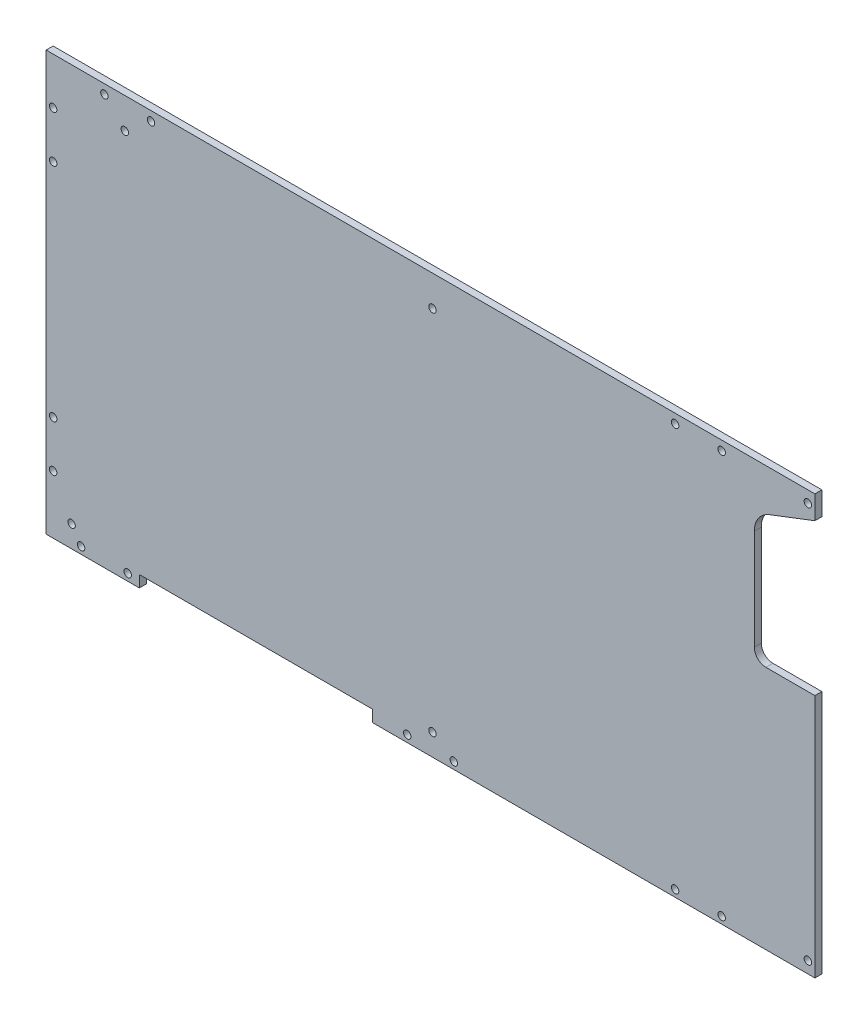
ISO-10303-21;
HEADER;
FILE_DESCRIPTION(('STEP AP214'),'2;1');
FILE_NAME('part.step','',(''),(''),'','','');
FILE_SCHEMA(('AUTOMOTIVE_DESIGN { 1 0 10303 214 1 1 1 1 }'));
ENDSEC;
DATA;
#1=APPLICATION_CONTEXT('core data for automotive mechanical design processes');
#2=APPLICATION_PROTOCOL_DEFINITION('international standard','automotive_design',2000,#1);
#3=PRODUCT_CONTEXT('',#1,'mechanical');
#4=PRODUCT('Part','Part','',(#3));
#5=PRODUCT_RELATED_PRODUCT_CATEGORY('part','',(#4));
#6=PRODUCT_DEFINITION_FORMATION('','',#4);
#7=PRODUCT_DEFINITION_CONTEXT('part definition',#1,'design');
#8=PRODUCT_DEFINITION('design','',#6,#7);
#9=PRODUCT_DEFINITION_SHAPE('','',#8);
#10=(LENGTH_UNIT() NAMED_UNIT(*) SI_UNIT(.MILLI.,.METRE.));
#11=(NAMED_UNIT(*) PLANE_ANGLE_UNIT() SI_UNIT($,.RADIAN.));
#12=(NAMED_UNIT(*) SI_UNIT($,.STERADIAN.) SOLID_ANGLE_UNIT());
#13=UNCERTAINTY_MEASURE_WITH_UNIT(LENGTH_MEASURE(1.E-05),#10,'distance_accuracy_value','');
#14=(GEOMETRIC_REPRESENTATION_CONTEXT(3) GLOBAL_UNCERTAINTY_ASSIGNED_CONTEXT((#13)) GLOBAL_UNIT_ASSIGNED_CONTEXT((#10,
#11,#12)) REPRESENTATION_CONTEXT('',''));
#15=CARTESIAN_POINT('',(0.,0.,0.));
#16=DIRECTION('',(0.,0.,1.));
#17=DIRECTION('',(1.,0.,0.));
#18=AXIS2_PLACEMENT_3D('',#15,#16,#17);
#19=CARTESIAN_POINT('',(330.,0.,3.));
#20=DIRECTION('',(-1.,0.,0.));
#21=DIRECTION('',(0.,0.,1.));
#22=AXIS2_PLACEMENT_3D('',#19,#20,#21);
#23=PLANE('',#22);
#24=DIRECTION('',(0.,1.,0.));
#25=VECTOR('',#24,1.);
#26=CARTESIAN_POINT('',(330.,0.,3.));
#27=LINE('',#26,#25);
#28=CARTESIAN_POINT('',(330.,170.,3.));
#29=VERTEX_POINT('',#28);
#30=CARTESIAN_POINT('',(330.,180.,3.));
#31=VERTEX_POINT('',#30);
#32=EDGE_CURVE('E201',#29,#31,#27,.T.);
#33=ORIENTED_EDGE('',*,*,#32,.F.);
#34=DIRECTION('',(0.,0.,1.));
#35=VECTOR('',#34,1.);
#36=CARTESIAN_POINT('',(330.,170.,-0.00100000000000013));
#37=LINE('',#36,#35);
#38=CARTESIAN_POINT('',(330.,170.,0.));
#39=VERTEX_POINT('',#38);
#40=EDGE_CURVE('E143',#39,#29,#37,.T.);
#41=ORIENTED_EDGE('',*,*,#40,.F.);
#42=DIRECTION('',(0.,1.,0.));
#43=VECTOR('',#42,1.);
#44=CARTESIAN_POINT('',(330.,0.,0.));
#45=LINE('',#44,#43);
#46=CARTESIAN_POINT('',(330.,180.,0.));
#47=VERTEX_POINT('',#46);
#48=EDGE_CURVE('E162',#39,#47,#45,.T.);
#49=ORIENTED_EDGE('',*,*,#48,.T.);
#50=DIRECTION('',(0.,0.,-1.));
#51=VECTOR('',#50,1.);
#52=CARTESIAN_POINT('',(330.,180.,3.));
#53=LINE('',#52,#51);
#54=EDGE_CURVE('E173',#31,#47,#53,.T.);
#55=ORIENTED_EDGE('',*,*,#54,.F.);
#56=EDGE_LOOP('',(#33,#41,#49,#55));
#57=FACE_BOUND('',#56,.T.);
#58=ADVANCED_FACE('F32',(#57),#23,.F.);
#59=CARTESIAN_POINT('',(0.,0.,3.));
#60=DIRECTION('',(0.,1.,0.));
#61=DIRECTION('',(0.,0.,1.));
#62=AXIS2_PLACEMENT_3D('',#59,#60,#61);
#63=PLANE('',#62);
#64=DIRECTION('',(1.,0.,0.));
#65=VECTOR('',#64,1.);
#66=CARTESIAN_POINT('',(0.,0.,0.));
#67=LINE('',#66,#65);
#68=CARTESIAN_POINT('',(0.,0.,0.));
#69=VERTEX_POINT('',#68);
#70=CARTESIAN_POINT('',(40.,0.,0.));
#71=VERTEX_POINT('',#70);
#72=EDGE_CURVE('E166',#69,#71,#67,.T.);
#73=ORIENTED_EDGE('',*,*,#72,.T.);
#74=DIRECTION('',(0.,0.,1.));
#75=VECTOR('',#74,1.);
#76=CARTESIAN_POINT('',(40.,0.,-0.00100000000000013));
#77=LINE('',#76,#75);
#78=CARTESIAN_POINT('',(40.,0.,3.));
#79=VERTEX_POINT('',#78);
#80=EDGE_CURVE('E325',#71,#79,#77,.T.);
#81=ORIENTED_EDGE('',*,*,#80,.T.);
#82=DIRECTION('',(1.,0.,0.));
#83=VECTOR('',#82,1.);
#84=CARTESIAN_POINT('',(0.,0.,3.));
#85=LINE('',#84,#83);
#86=CARTESIAN_POINT('',(0.,0.,3.));
#87=VERTEX_POINT('',#86);
#88=EDGE_CURVE('E202',#87,#79,#85,.T.);
#89=ORIENTED_EDGE('',*,*,#88,.F.);
#90=DIRECTION('',(0.,0.,-1.));
#91=VECTOR('',#90,1.);
#92=CARTESIAN_POINT('',(0.,0.,3.));
#93=LINE('',#92,#91);
#94=EDGE_CURVE('E11',#87,#69,#93,.T.);
#95=ORIENTED_EDGE('',*,*,#94,.T.);
#96=EDGE_LOOP('',(#73,#81,#89,#95));
#97=FACE_BOUND('',#96,.T.);
#98=ADVANCED_FACE('F396',(#97),#63,.F.);
#99=CARTESIAN_POINT('',(0.,0.,3.));
#100=DIRECTION('',(1.,0.,0.));
#101=DIRECTION('',(0.,0.,-1.));
#102=AXIS2_PLACEMENT_3D('',#99,#100,#101);
#103=PLANE('',#102);
#104=DIRECTION('',(0.,-1.,0.));
#105=VECTOR('',#104,1.);
#106=CARTESIAN_POINT('',(0.,0.,0.));
#107=LINE('',#106,#105);
#108=CARTESIAN_POINT('',(0.,180.,0.));
#109=VERTEX_POINT('',#108);
#110=EDGE_CURVE('E187',#109,#69,#107,.T.);
#111=ORIENTED_EDGE('',*,*,#110,.T.);
#112=ORIENTED_EDGE('',*,*,#94,.F.);
#113=DIRECTION('',(0.,-1.,0.));
#114=VECTOR('',#113,1.);
#115=CARTESIAN_POINT('',(0.,0.,3.));
#116=LINE('',#115,#114);
#117=CARTESIAN_POINT('',(0.,180.,3.));
#118=VERTEX_POINT('',#117);
#119=EDGE_CURVE('E164',#118,#87,#116,.T.);
#120=ORIENTED_EDGE('',*,*,#119,.F.);
#121=DIRECTION('',(0.,0.,-1.));
#122=VECTOR('',#121,1.);
#123=CARTESIAN_POINT('',(0.,180.,3.));
#124=LINE('',#123,#122);
#125=EDGE_CURVE('E170',#118,#109,#124,.T.);
#126=ORIENTED_EDGE('',*,*,#125,.T.);
#127=EDGE_LOOP('',(#111,#112,#120,#126));
#128=FACE_BOUND('',#127,.T.);
#129=ADVANCED_FACE('F34',(#128),#103,.F.);
#130=CARTESIAN_POINT('',(140.,0.,3.));
#131=VERTEX_POINT('',#130);
#132=CARTESIAN_POINT('',(330.,0.,3.));
#133=VERTEX_POINT('',#132);
#134=EDGE_CURVE('E205',#131,#133,#85,.T.);
#135=ORIENTED_EDGE('',*,*,#134,.F.);
#136=DIRECTION('',(0.,0.,1.));
#137=VECTOR('',#136,1.);
#138=CARTESIAN_POINT('',(140.,0.,-0.00100000000000013));
#139=LINE('',#138,#137);
#140=CARTESIAN_POINT('',(140.,0.,0.));
#141=VERTEX_POINT('',#140);
#142=EDGE_CURVE('E328',#141,#131,#139,.T.);
#143=ORIENTED_EDGE('',*,*,#142,.F.);
#144=CARTESIAN_POINT('',(330.,0.,0.));
#145=VERTEX_POINT('',#144);
#146=EDGE_CURVE('E192',#141,#145,#67,.T.);
#147=ORIENTED_EDGE('',*,*,#146,.T.);
#148=DIRECTION('',(0.,0.,-1.));
#149=VECTOR('',#148,1.);
#150=CARTESIAN_POINT('',(330.,0.,3.));
#151=LINE('',#150,#149);
#152=EDGE_CURVE('E40',#133,#145,#151,.T.);
#153=ORIENTED_EDGE('',*,*,#152,.F.);
#154=EDGE_LOOP('',(#135,#143,#147,#153));
#155=FACE_BOUND('',#154,.T.);
#156=ADVANCED_FACE('F387',(#155),#63,.F.);
#157=CARTESIAN_POINT('',(330.,105.,0.));
#158=VERTEX_POINT('',#157);
#159=EDGE_CURVE('E153',#145,#158,#45,.T.);
#160=ORIENTED_EDGE('',*,*,#159,.T.);
#161=DIRECTION('',(0.,0.,1.));
#162=VECTOR('',#161,1.);
#163=CARTESIAN_POINT('',(330.,105.,-0.00100000000000013));
#164=LINE('',#163,#162);
#165=CARTESIAN_POINT('',(330.,105.,3.));
#166=VERTEX_POINT('',#165);
#167=EDGE_CURVE('E132',#158,#166,#164,.T.);
#168=ORIENTED_EDGE('',*,*,#167,.T.);
#169=EDGE_CURVE('E199',#133,#166,#27,.T.);
#170=ORIENTED_EDGE('',*,*,#169,.F.);
#171=ORIENTED_EDGE('',*,*,#152,.T.);
#172=EDGE_LOOP('',(#160,#168,#170,#171));
#173=FACE_BOUND('',#172,.T.);
#174=ADVANCED_FACE('F159',(#173),#23,.F.);
#175=CARTESIAN_POINT('',(0.,180.,3.));
#176=DIRECTION('',(0.,-1.,0.));
#177=DIRECTION('',(0.,0.,-1.));
#178=AXIS2_PLACEMENT_3D('',#175,#176,#177);
#179=PLANE('',#178);
#180=DIRECTION('',(-1.,0.,0.));
#181=VECTOR('',#180,1.);
#182=CARTESIAN_POINT('',(0.,180.,0.));
#183=LINE('',#182,#181);
#184=EDGE_CURVE('E161',#47,#109,#183,.T.);
#185=ORIENTED_EDGE('',*,*,#184,.T.);
#186=ORIENTED_EDGE('',*,*,#125,.F.);
#187=DIRECTION('',(-1.,0.,0.));
#188=VECTOR('',#187,1.);
#189=CARTESIAN_POINT('',(0.,180.,3.));
#190=LINE('',#189,#188);
#191=EDGE_CURVE('E174',#31,#118,#190,.T.);
#192=ORIENTED_EDGE('',*,*,#191,.F.);
#193=ORIENTED_EDGE('',*,*,#54,.T.);
#194=EDGE_LOOP('',(#185,#186,#192,#193));
#195=FACE_BOUND('',#194,.T.);
#196=ADVANCED_FACE('F180',(#195),#179,.F.);
#197=CARTESIAN_POINT('',(0.,0.,3.));
#198=DIRECTION('',(0.,0.,-1.));
#199=DIRECTION('',(-1.,0.,0.));
#200=AXIS2_PLACEMENT_3D('',#197,#198,#199);
#201=PLANE('',#200);
#202=CARTESIAN_POINT('',(3.,140.,3.));
#203=DIRECTION('',(0.,0.,1.));
#204=DIRECTION('',(1.,0.,0.));
#205=AXIS2_PLACEMENT_3D('',#202,#203,#204);
#206=CIRCLE('',#205,1.6);
#207=CARTESIAN_POINT('',(4.6,140.,3.));
#208=VERTEX_POINT('',#207);
#209=EDGE_CURVE('E278',#208,#208,#206,.T.);
#210=ORIENTED_EDGE('',*,*,#209,.F.);
#211=EDGE_LOOP('',(#210));
#212=FACE_BOUND('',#211,.T.);
#213=CARTESIAN_POINT('',(3.,45.,3.));
#214=DIRECTION('',(0.,0.,1.));
#215=DIRECTION('',(1.,0.,0.));
#216=AXIS2_PLACEMENT_3D('',#213,#214,#215);
#217=CIRCLE('',#216,1.6);
#218=CARTESIAN_POINT('',(4.6,45.,3.));
#219=VERTEX_POINT('',#218);
#220=EDGE_CURVE('E272',#219,#219,#217,.T.);
#221=ORIENTED_EDGE('',*,*,#220,.F.);
#222=EDGE_LOOP('',(#221));
#223=FACE_BOUND('',#222,.T.);
#224=CARTESIAN_POINT('',(3.,25.,3.));
#225=DIRECTION('',(0.,0.,1.));
#226=DIRECTION('',(1.,0.,0.));
#227=AXIS2_PLACEMENT_3D('',#224,#225,#226);
#228=CIRCLE('',#227,1.6);
#229=CARTESIAN_POINT('',(4.6,25.,3.));
#230=VERTEX_POINT('',#229);
#231=EDGE_CURVE('E266',#230,#230,#228,.T.);
#232=ORIENTED_EDGE('',*,*,#231,.F.);
#233=EDGE_LOOP('',(#232));
#234=FACE_BOUND('',#233,.T.);
#235=CARTESIAN_POINT('',(15.,3.,3.));
#236=DIRECTION('',(0.,0.,1.));
#237=DIRECTION('',(1.,0.,0.));
#238=AXIS2_PLACEMENT_3D('',#235,#236,#237);
#239=CIRCLE('',#238,1.6);
#240=CARTESIAN_POINT('',(16.6,3.,3.));
#241=VERTEX_POINT('',#240);
#242=EDGE_CURVE('E248',#241,#241,#239,.T.);
#243=ORIENTED_EDGE('',*,*,#242,.F.);
#244=EDGE_LOOP('',(#243));
#245=FACE_BOUND('',#244,.T.);
#246=CARTESIAN_POINT('',(25.,176.,3.));
#247=DIRECTION('',(0.,0.,1.));
#248=DIRECTION('',(1.,0.,0.));
#249=AXIS2_PLACEMENT_3D('',#246,#247,#248);
#250=CIRCLE('',#249,1.59999999999999);
#251=CARTESIAN_POINT('',(26.6,176.,3.));
#252=VERTEX_POINT('',#251);
#253=EDGE_CURVE('E249',#252,#252,#250,.T.);
#254=ORIENTED_EDGE('',*,*,#253,.F.);
#255=EDGE_LOOP('',(#254));
#256=FACE_BOUND('',#255,.T.);
#257=CARTESIAN_POINT('',(175.,3.,3.));
#258=DIRECTION('',(0.,0.,1.));
#259=DIRECTION('',(1.,0.,0.));
#260=AXIS2_PLACEMENT_3D('',#257,#258,#259);
#261=CIRCLE('',#260,1.59999999999996);
#262=CARTESIAN_POINT('',(176.6,3.,3.));
#263=VERTEX_POINT('',#262);
#264=EDGE_CURVE('E256',#263,#263,#261,.T.);
#265=ORIENTED_EDGE('',*,*,#264,.F.);
#266=EDGE_LOOP('',(#265));
#267=FACE_BOUND('',#266,.T.);
#268=CARTESIAN_POINT('',(155.,3.,3.));
#269=DIRECTION('',(0.,0.,1.));
#270=DIRECTION('',(1.,0.,0.));
#271=AXIS2_PLACEMENT_3D('',#268,#269,#270);
#272=CIRCLE('',#271,1.59999999999996);
#273=CARTESIAN_POINT('',(156.6,3.,3.));
#274=VERTEX_POINT('',#273);
#275=EDGE_CURVE('E235',#274,#274,#272,.T.);
#276=ORIENTED_EDGE('',*,*,#275,.F.);
#277=EDGE_LOOP('',(#276));
#278=FACE_BOUND('',#277,.T.);
#279=CARTESIAN_POINT('',(35.,3.,3.));
#280=DIRECTION('',(0.,0.,1.));
#281=DIRECTION('',(1.,0.,0.));
#282=AXIS2_PLACEMENT_3D('',#279,#280,#281);
#283=CIRCLE('',#282,1.60000000000001);
#284=CARTESIAN_POINT('',(36.6,3.,3.));
#285=VERTEX_POINT('',#284);
#286=EDGE_CURVE('E242',#285,#285,#283,.T.);
#287=ORIENTED_EDGE('',*,*,#286,.F.);
#288=EDGE_LOOP('',(#287));
#289=FACE_BOUND('',#288,.T.);
#290=CARTESIAN_POINT('',(327.,175.,3.));
#291=DIRECTION('',(0.,0.,1.));
#292=DIRECTION('',(1.,0.,0.));
#293=AXIS2_PLACEMENT_3D('',#290,#291,#292);
#294=CIRCLE('',#293,1.59999999999996);
#295=CARTESIAN_POINT('',(328.6,175.,3.));
#296=VERTEX_POINT('',#295);
#297=EDGE_CURVE('E307',#296,#296,#294,.T.);
#298=ORIENTED_EDGE('',*,*,#297,.F.);
#299=EDGE_LOOP('',(#298));
#300=FACE_BOUND('',#299,.T.);
#301=CARTESIAN_POINT('',(327.,5.,3.));
#302=DIRECTION('',(0.,0.,1.));
#303=DIRECTION('',(1.,0.,0.));
#304=AXIS2_PLACEMENT_3D('',#301,#302,#303);
#305=CIRCLE('',#304,1.59999999999996);
#306=CARTESIAN_POINT('',(328.6,5.,3.));
#307=VERTEX_POINT('',#306);
#308=EDGE_CURVE('E314',#307,#307,#305,.T.);
#309=ORIENTED_EDGE('',*,*,#308,.F.);
#310=EDGE_LOOP('',(#309));
#311=FACE_BOUND('',#310,.T.);
#312=CARTESIAN_POINT('',(290.,3.,3.));
#313=DIRECTION('',(0.,0.,1.));
#314=DIRECTION('',(1.,0.,0.));
#315=AXIS2_PLACEMENT_3D('',#312,#313,#314);
#316=CIRCLE('',#315,1.59999999999996);
#317=CARTESIAN_POINT('',(291.6,3.,3.));
#318=VERTEX_POINT('',#317);
#319=EDGE_CURVE('E320',#318,#318,#316,.T.);
#320=ORIENTED_EDGE('',*,*,#319,.F.);
#321=EDGE_LOOP('',(#320));
#322=FACE_BOUND('',#321,.T.);
#323=CARTESIAN_POINT('',(45.,176.,3.));
#324=DIRECTION('',(0.,0.,1.));
#325=DIRECTION('',(1.,0.,0.));
#326=AXIS2_PLACEMENT_3D('',#323,#324,#325);
#327=CIRCLE('',#326,1.6);
#328=CARTESIAN_POINT('',(46.6,176.,3.));
#329=VERTEX_POINT('',#328);
#330=EDGE_CURVE('E290',#329,#329,#327,.T.);
#331=ORIENTED_EDGE('',*,*,#330,.F.);
#332=EDGE_LOOP('',(#331));
#333=FACE_BOUND('',#332,.T.);
#334=CARTESIAN_POINT('',(270.,176.,3.));
#335=DIRECTION('',(0.,0.,1.));
#336=DIRECTION('',(1.,0.,0.));
#337=AXIS2_PLACEMENT_3D('',#334,#335,#336);
#338=CIRCLE('',#337,1.59999999999996);
#339=CARTESIAN_POINT('',(271.6,176.,3.));
#340=VERTEX_POINT('',#339);
#341=EDGE_CURVE('E283',#340,#340,#338,.T.);
#342=ORIENTED_EDGE('',*,*,#341,.F.);
#343=EDGE_LOOP('',(#342));
#344=FACE_BOUND('',#343,.T.);
#345=CARTESIAN_POINT('',(290.,176.,3.));
#346=DIRECTION('',(0.,0.,1.));
#347=DIRECTION('',(1.,0.,0.));
#348=AXIS2_PLACEMENT_3D('',#345,#346,#347);
#349=CIRCLE('',#348,1.59999999999996);
#350=CARTESIAN_POINT('',(291.6,176.,3.));
#351=VERTEX_POINT('',#350);
#352=EDGE_CURVE('E302',#351,#351,#349,.T.);
#353=ORIENTED_EDGE('',*,*,#352,.F.);
#354=EDGE_LOOP('',(#353));
#355=FACE_BOUND('',#354,.T.);
#356=CARTESIAN_POINT('',(270.,3.,3.));
#357=DIRECTION('',(0.,0.,1.));
#358=DIRECTION('',(1.,0.,0.));
#359=AXIS2_PLACEMENT_3D('',#356,#357,#358);
#360=CIRCLE('',#359,1.59999999999996);
#361=CARTESIAN_POINT('',(271.6,3.,3.));
#362=VERTEX_POINT('',#361);
#363=EDGE_CURVE('E295',#362,#362,#360,.T.);
#364=ORIENTED_EDGE('',*,*,#363,.F.);
#365=EDGE_LOOP('',(#364));
#366=FACE_BOUND('',#365,.T.);
#367=CARTESIAN_POINT('',(3.,160.,3.));
#368=DIRECTION('',(0.,0.,1.));
#369=DIRECTION('',(1.,0.,0.));
#370=AXIS2_PLACEMENT_3D('',#367,#368,#369);
#371=CIRCLE('',#370,1.6);
#372=CARTESIAN_POINT('',(4.6,160.,3.));
#373=VERTEX_POINT('',#372);
#374=EDGE_CURVE('E229',#373,#373,#371,.T.);
#375=ORIENTED_EDGE('',*,*,#374,.F.);
#376=EDGE_LOOP('',(#375));
#377=FACE_BOUND('',#376,.T.);
#378=CARTESIAN_POINT('',(165.85,166.83,3.));
#379=DIRECTION('',(0.,0.,1.));
#380=DIRECTION('',(1.,0.,0.));
#381=AXIS2_PLACEMENT_3D('',#378,#379,#380);
#382=CIRCLE('',#381,1.59999999999999);
#383=CARTESIAN_POINT('',(167.45,166.83,3.));
#384=VERTEX_POINT('',#383);
#385=EDGE_CURVE('E218',#384,#384,#382,.T.);
#386=ORIENTED_EDGE('',*,*,#385,.F.);
#387=EDGE_LOOP('',(#386));
#388=FACE_BOUND('',#387,.T.);
#389=CARTESIAN_POINT('',(10.91,9.35,3.));
#390=DIRECTION('',(0.,0.,1.));
#391=DIRECTION('',(1.,0.,0.));
#392=AXIS2_PLACEMENT_3D('',#389,#390,#391);
#393=CIRCLE('',#392,1.6);
#394=CARTESIAN_POINT('',(12.51,9.35,3.));
#395=VERTEX_POINT('',#394);
#396=EDGE_CURVE('E211',#395,#395,#393,.T.);
#397=ORIENTED_EDGE('',*,*,#396,.F.);
#398=EDGE_LOOP('',(#397));
#399=FACE_BOUND('',#398,.T.);
#400=CARTESIAN_POINT('',(165.85,9.35,3.));
#401=DIRECTION('',(0.,0.,1.));
#402=DIRECTION('',(1.,0.,0.));
#403=AXIS2_PLACEMENT_3D('',#400,#401,#402);
#404=CIRCLE('',#403,1.59999999999999);
#405=CARTESIAN_POINT('',(167.45,9.35,3.));
#406=VERTEX_POINT('',#405);
#407=EDGE_CURVE('E223',#406,#406,#404,.T.);
#408=ORIENTED_EDGE('',*,*,#407,.F.);
#409=EDGE_LOOP('',(#408));
#410=FACE_BOUND('',#409,.T.);
#411=CARTESIAN_POINT('',(33.77,166.83,3.));
#412=DIRECTION('',(0.,0.,1.));
#413=DIRECTION('',(1.,0.,0.));
#414=AXIS2_PLACEMENT_3D('',#411,#412,#413);
#415=CIRCLE('',#414,1.6);
#416=CARTESIAN_POINT('',(35.37,166.83,3.));
#417=VERTEX_POINT('',#416);
#418=EDGE_CURVE('E195',#417,#417,#415,.T.);
#419=ORIENTED_EDGE('',*,*,#418,.F.);
#420=EDGE_LOOP('',(#419));
#421=FACE_BOUND('',#420,.T.);
#422=CARTESIAN_POINT('',(314.,153.132009017551,3.));
#423=DIRECTION('',(0.,0.,1.));
#424=DIRECTION('',(-1.,0.,0.));
#425=AXIS2_PLACEMENT_3D('',#422,#423,#424);
#426=CIRCLE('',#425,10.);
#427=CARTESIAN_POINT('',(310.410209206911,162.465465079581,3.));
#428=VERTEX_POINT('',#427);
#429=CARTESIAN_POINT('',(304.,153.132009017551,3.));
#430=VERTEX_POINT('',#429);
#431=EDGE_CURVE('E364',#428,#430,#426,.T.);
#432=ORIENTED_EDGE('',*,*,#431,.F.);
#433=DIRECTION('',(-0.93334560620306,-0.358979079308868,0.));
#434=VECTOR('',#433,1.);
#435=CARTESIAN_POINT('',(310.410209206911,162.465465079581,3.));
#436=LINE('',#435,#434);
#437=EDGE_CURVE('E366',#29,#428,#436,.T.);
#438=ORIENTED_EDGE('',*,*,#437,.F.);
#439=ORIENTED_EDGE('',*,*,#32,.T.);
#440=ORIENTED_EDGE('',*,*,#191,.T.);
#441=ORIENTED_EDGE('',*,*,#119,.T.);
#442=ORIENTED_EDGE('',*,*,#88,.T.);
#443=DIRECTION('',(0.,-1.,0.));
#444=VECTOR('',#443,1.);
#445=CARTESIAN_POINT('',(40.,0.,3.));
#446=LINE('',#445,#444);
#447=CARTESIAN_POINT('',(40.,5.,3.));
#448=VERTEX_POINT('',#447);
#449=EDGE_CURVE('E337',#448,#79,#446,.T.);
#450=ORIENTED_EDGE('',*,*,#449,.F.);
#451=DIRECTION('',(-1.,0.,0.));
#452=VECTOR('',#451,1.);
#453=CARTESIAN_POINT('',(40.,5.,3.));
#454=LINE('',#453,#452);
#455=CARTESIAN_POINT('',(140.,5.,3.));
#456=VERTEX_POINT('',#455);
#457=EDGE_CURVE('E329',#456,#448,#454,.T.);
#458=ORIENTED_EDGE('',*,*,#457,.F.);
#459=DIRECTION('',(0.,1.,0.));
#460=VECTOR('',#459,1.);
#461=CARTESIAN_POINT('',(140.,0.,3.));
#462=LINE('',#461,#460);
#463=EDGE_CURVE('E335',#131,#456,#462,.T.);
#464=ORIENTED_EDGE('',*,*,#463,.F.);
#465=ORIENTED_EDGE('',*,*,#134,.T.);
#466=ORIENTED_EDGE('',*,*,#169,.T.);
#467=DIRECTION('',(1.,0.,0.));
#468=VECTOR('',#467,1.);
#469=CARTESIAN_POINT('',(330.,105.,3.));
#470=LINE('',#469,#468);
#471=CARTESIAN_POINT('',(309.,105.,3.));
#472=VERTEX_POINT('',#471);
#473=EDGE_CURVE('E138',#472,#166,#470,.T.);
#474=ORIENTED_EDGE('',*,*,#473,.F.);
#475=CARTESIAN_POINT('',(309.,110.,3.));
#476=DIRECTION('',(0.,0.,1.));
#477=DIRECTION('',(-1.,0.,0.));
#478=AXIS2_PLACEMENT_3D('',#475,#476,#477);
#479=CIRCLE('',#478,5.);
#480=CARTESIAN_POINT('',(304.,110.,3.));
#481=VERTEX_POINT('',#480);
#482=EDGE_CURVE('E358',#481,#472,#479,.T.);
#483=ORIENTED_EDGE('',*,*,#482,.F.);
#484=DIRECTION('',(0.,-1.,0.));
#485=VECTOR('',#484,1.);
#486=CARTESIAN_POINT('',(304.,153.132009017551,3.));
#487=LINE('',#486,#485);
#488=EDGE_CURVE('E361',#430,#481,#487,.T.);
#489=ORIENTED_EDGE('',*,*,#488,.F.);
#490=EDGE_LOOP('',(#432,#438,#439,#440,#441,#442,#450,#458,#464,#465,#466,#474,#483,#489));
#491=FACE_BOUND('',#490,.T.);
#492=ADVANCED_FACE('F381',(#212,#223,#234,#245,#256,#267,#278,#289,#300,#311,#322,#333,#344,
#355,#366,#377,#388,#399,#410,#421,#491),#201,.F.);
#493=CARTESIAN_POINT('',(0.,0.,0.));
#494=DIRECTION('',(0.,0.,-1.));
#495=DIRECTION('',(-1.,0.,0.));
#496=AXIS2_PLACEMENT_3D('',#493,#494,#495);
#497=PLANE('',#496);
#498=DIRECTION('',(-0.93334560620306,-0.358979079308868,0.));
#499=VECTOR('',#498,1.);
#500=CARTESIAN_POINT('',(310.410209206911,162.465465079581,0.));
#501=LINE('',#500,#499);
#502=CARTESIAN_POINT('',(310.410209206911,162.465465079581,0.));
#503=VERTEX_POINT('',#502);
#504=EDGE_CURVE('E156',#39,#503,#501,.T.);
#505=ORIENTED_EDGE('',*,*,#504,.T.);
#506=CARTESIAN_POINT('',(314.,153.132009017551,0.));
#507=DIRECTION('',(0.,0.,-1.));
#508=DIRECTION('',(-1.,0.,0.));
#509=AXIS2_PLACEMENT_3D('',#506,#507,#508);
#510=CIRCLE('',#509,10.);
#511=CARTESIAN_POINT('',(304.,153.132009017551,0.));
#512=VERTEX_POINT('',#511);
#513=EDGE_CURVE('E347',#503,#512,#510,.F.);
#514=ORIENTED_EDGE('',*,*,#513,.T.);
#515=DIRECTION('',(0.,-1.,0.));
#516=VECTOR('',#515,1.);
#517=CARTESIAN_POINT('',(304.,153.132009017551,0.));
#518=LINE('',#517,#516);
#519=CARTESIAN_POINT('',(304.,110.,0.));
#520=VERTEX_POINT('',#519);
#521=EDGE_CURVE('E371',#512,#520,#518,.T.);
#522=ORIENTED_EDGE('',*,*,#521,.T.);
#523=CARTESIAN_POINT('',(309.,110.,0.));
#524=DIRECTION('',(0.,0.,-1.));
#525=DIRECTION('',(-1.,0.,0.));
#526=AXIS2_PLACEMENT_3D('',#523,#524,#525);
#527=CIRCLE('',#526,5.);
#528=CARTESIAN_POINT('',(309.,105.,0.));
#529=VERTEX_POINT('',#528);
#530=EDGE_CURVE('E155',#520,#529,#527,.F.);
#531=ORIENTED_EDGE('',*,*,#530,.T.);
#532=DIRECTION('',(1.,0.,0.));
#533=VECTOR('',#532,1.);
#534=CARTESIAN_POINT('',(330.,105.,0.));
#535=LINE('',#534,#533);
#536=EDGE_CURVE('E135',#529,#158,#535,.T.);
#537=ORIENTED_EDGE('',*,*,#536,.T.);
#538=ORIENTED_EDGE('',*,*,#159,.F.);
#539=ORIENTED_EDGE('',*,*,#146,.F.);
#540=DIRECTION('',(0.,1.,0.));
#541=VECTOR('',#540,1.);
#542=CARTESIAN_POINT('',(140.,0.,0.));
#543=LINE('',#542,#541);
#544=CARTESIAN_POINT('',(140.,5.,0.));
#545=VERTEX_POINT('',#544);
#546=EDGE_CURVE('E344',#141,#545,#543,.T.);
#547=ORIENTED_EDGE('',*,*,#546,.T.);
#548=DIRECTION('',(-1.,0.,0.));
#549=VECTOR('',#548,1.);
#550=CARTESIAN_POINT('',(40.,5.,0.));
#551=LINE('',#550,#549);
#552=CARTESIAN_POINT('',(40.,5.,0.));
#553=VERTEX_POINT('',#552);
#554=EDGE_CURVE('E341',#545,#553,#551,.T.);
#555=ORIENTED_EDGE('',*,*,#554,.T.);
#556=DIRECTION('',(0.,-1.,0.));
#557=VECTOR('',#556,1.);
#558=CARTESIAN_POINT('',(40.,0.,0.));
#559=LINE('',#558,#557);
#560=EDGE_CURVE('E339',#553,#71,#559,.T.);
#561=ORIENTED_EDGE('',*,*,#560,.T.);
#562=ORIENTED_EDGE('',*,*,#72,.F.);
#563=ORIENTED_EDGE('',*,*,#110,.F.);
#564=ORIENTED_EDGE('',*,*,#184,.F.);
#565=ORIENTED_EDGE('',*,*,#48,.F.);
#566=EDGE_LOOP('',(#505,#514,#522,#531,#537,#538,#539,#547,#555,#561,#562,#563,#564,#565));
#567=FACE_BOUND('',#566,.T.);
#568=CARTESIAN_POINT('',(3.,140.,0.));
#569=DIRECTION('',(0.,0.,1.));
#570=DIRECTION('',(1.,0.,0.));
#571=AXIS2_PLACEMENT_3D('',#568,#569,#570);
#572=CIRCLE('',#571,1.6);
#573=CARTESIAN_POINT('',(4.6,140.,0.));
#574=VERTEX_POINT('',#573);
#575=EDGE_CURVE('E232',#574,#574,#572,.T.);
#576=ORIENTED_EDGE('',*,*,#575,.T.);
#577=EDGE_LOOP('',(#576));
#578=FACE_BOUND('',#577,.T.);
#579=CARTESIAN_POINT('',(3.,45.,0.));
#580=DIRECTION('',(0.,0.,1.));
#581=DIRECTION('',(1.,0.,0.));
#582=AXIS2_PLACEMENT_3D('',#579,#580,#581);
#583=CIRCLE('',#582,1.6);
#584=CARTESIAN_POINT('',(4.6,45.,0.));
#585=VERTEX_POINT('',#584);
#586=EDGE_CURVE('E275',#585,#585,#583,.T.);
#587=ORIENTED_EDGE('',*,*,#586,.T.);
#588=EDGE_LOOP('',(#587));
#589=FACE_BOUND('',#588,.T.);
#590=CARTESIAN_POINT('',(3.,25.,0.));
#591=DIRECTION('',(0.,0.,1.));
#592=DIRECTION('',(1.,0.,0.));
#593=AXIS2_PLACEMENT_3D('',#590,#591,#592);
#594=CIRCLE('',#593,1.6);
#595=CARTESIAN_POINT('',(4.6,25.,0.));
#596=VERTEX_POINT('',#595);
#597=EDGE_CURVE('E269',#596,#596,#594,.T.);
#598=ORIENTED_EDGE('',*,*,#597,.T.);
#599=EDGE_LOOP('',(#598));
#600=FACE_BOUND('',#599,.T.);
#601=CARTESIAN_POINT('',(15.,3.,0.));
#602=DIRECTION('',(0.,0.,1.));
#603=DIRECTION('',(1.,0.,0.));
#604=AXIS2_PLACEMENT_3D('',#601,#602,#603);
#605=CIRCLE('',#604,1.6);
#606=CARTESIAN_POINT('',(16.6,3.,0.));
#607=VERTEX_POINT('',#606);
#608=EDGE_CURVE('E263',#607,#607,#605,.T.);
#609=ORIENTED_EDGE('',*,*,#608,.T.);
#610=EDGE_LOOP('',(#609));
#611=FACE_BOUND('',#610,.T.);
#612=CARTESIAN_POINT('',(25.,176.,0.));
#613=DIRECTION('',(0.,0.,1.));
#614=DIRECTION('',(1.,0.,0.));
#615=AXIS2_PLACEMENT_3D('',#612,#613,#614);
#616=CIRCLE('',#615,1.59999999999999);
#617=CARTESIAN_POINT('',(26.6,176.,0.));
#618=VERTEX_POINT('',#617);
#619=EDGE_CURVE('E252',#618,#618,#616,.T.);
#620=ORIENTED_EDGE('',*,*,#619,.T.);
#621=EDGE_LOOP('',(#620));
#622=FACE_BOUND('',#621,.T.);
#623=CARTESIAN_POINT('',(175.,3.,0.));
#624=DIRECTION('',(0.,0.,1.));
#625=DIRECTION('',(1.,0.,0.));
#626=AXIS2_PLACEMENT_3D('',#623,#624,#625);
#627=CIRCLE('',#626,1.59999999999996);
#628=CARTESIAN_POINT('',(176.6,3.,0.));
#629=VERTEX_POINT('',#628);
#630=EDGE_CURVE('E239',#629,#629,#627,.T.);
#631=ORIENTED_EDGE('',*,*,#630,.T.);
#632=EDGE_LOOP('',(#631));
#633=FACE_BOUND('',#632,.T.);
#634=CARTESIAN_POINT('',(155.,3.,0.));
#635=DIRECTION('',(0.,0.,1.));
#636=DIRECTION('',(1.,0.,0.));
#637=AXIS2_PLACEMENT_3D('',#634,#635,#636);
#638=CIRCLE('',#637,1.59999999999996);
#639=CARTESIAN_POINT('',(156.6,3.,0.));
#640=VERTEX_POINT('',#639);
#641=EDGE_CURVE('E238',#640,#640,#638,.T.);
#642=ORIENTED_EDGE('',*,*,#641,.T.);
#643=EDGE_LOOP('',(#642));
#644=FACE_BOUND('',#643,.T.);
#645=CARTESIAN_POINT('',(35.,3.,0.));
#646=DIRECTION('',(0.,0.,1.));
#647=DIRECTION('',(1.,0.,0.));
#648=AXIS2_PLACEMENT_3D('',#645,#646,#647);
#649=CIRCLE('',#648,1.60000000000001);
#650=CARTESIAN_POINT('',(36.6,3.,0.));
#651=VERTEX_POINT('',#650);
#652=EDGE_CURVE('E245',#651,#651,#649,.T.);
#653=ORIENTED_EDGE('',*,*,#652,.T.);
#654=EDGE_LOOP('',(#653));
#655=FACE_BOUND('',#654,.T.);
#656=CARTESIAN_POINT('',(327.,175.,0.));
#657=DIRECTION('',(0.,0.,1.));
#658=DIRECTION('',(1.,0.,0.));
#659=AXIS2_PLACEMENT_3D('',#656,#657,#658);
#660=CIRCLE('',#659,1.59999999999996);
#661=CARTESIAN_POINT('',(328.6,175.,0.));
#662=VERTEX_POINT('',#661);
#663=EDGE_CURVE('E310',#662,#662,#660,.T.);
#664=ORIENTED_EDGE('',*,*,#663,.T.);
#665=EDGE_LOOP('',(#664));
#666=FACE_BOUND('',#665,.T.);
#667=CARTESIAN_POINT('',(327.,5.,0.));
#668=DIRECTION('',(0.,0.,1.));
#669=DIRECTION('',(1.,0.,0.));
#670=AXIS2_PLACEMENT_3D('',#667,#668,#669);
#671=CIRCLE('',#670,1.59999999999996);
#672=CARTESIAN_POINT('',(328.6,5.,0.));
#673=VERTEX_POINT('',#672);
#674=EDGE_CURVE('E317',#673,#673,#671,.T.);
#675=ORIENTED_EDGE('',*,*,#674,.T.);
#676=EDGE_LOOP('',(#675));
#677=FACE_BOUND('',#676,.T.);
#678=CARTESIAN_POINT('',(290.,3.,0.));
#679=DIRECTION('',(0.,0.,1.));
#680=DIRECTION('',(1.,0.,0.));
#681=AXIS2_PLACEMENT_3D('',#678,#679,#680);
#682=CIRCLE('',#681,1.59999999999996);
#683=CARTESIAN_POINT('',(291.6,3.,0.));
#684=VERTEX_POINT('',#683);
#685=EDGE_CURVE('E299',#684,#684,#682,.T.);
#686=ORIENTED_EDGE('',*,*,#685,.T.);
#687=EDGE_LOOP('',(#686));
#688=FACE_BOUND('',#687,.T.);
#689=CARTESIAN_POINT('',(45.,176.,0.));
#690=DIRECTION('',(0.,0.,1.));
#691=DIRECTION('',(1.,0.,0.));
#692=AXIS2_PLACEMENT_3D('',#689,#690,#691);
#693=CIRCLE('',#692,1.6);
#694=CARTESIAN_POINT('',(46.6,176.,0.));
#695=VERTEX_POINT('',#694);
#696=EDGE_CURVE('E253',#695,#695,#693,.T.);
#697=ORIENTED_EDGE('',*,*,#696,.T.);
#698=EDGE_LOOP('',(#697));
#699=FACE_BOUND('',#698,.T.);
#700=CARTESIAN_POINT('',(270.,176.,0.));
#701=DIRECTION('',(0.,0.,1.));
#702=DIRECTION('',(1.,0.,0.));
#703=AXIS2_PLACEMENT_3D('',#700,#701,#702);
#704=CIRCLE('',#703,1.59999999999996);
#705=CARTESIAN_POINT('',(271.6,176.,0.));
#706=VERTEX_POINT('',#705);
#707=EDGE_CURVE('E286',#706,#706,#704,.T.);
#708=ORIENTED_EDGE('',*,*,#707,.T.);
#709=EDGE_LOOP('',(#708));
#710=FACE_BOUND('',#709,.T.);
#711=CARTESIAN_POINT('',(290.,176.,0.));
#712=DIRECTION('',(0.,0.,1.));
#713=DIRECTION('',(1.,0.,0.));
#714=AXIS2_PLACEMENT_3D('',#711,#712,#713);
#715=CIRCLE('',#714,1.59999999999996);
#716=CARTESIAN_POINT('',(291.6,176.,0.));
#717=VERTEX_POINT('',#716);
#718=EDGE_CURVE('E287',#717,#717,#715,.T.);
#719=ORIENTED_EDGE('',*,*,#718,.T.);
#720=EDGE_LOOP('',(#719));
#721=FACE_BOUND('',#720,.T.);
#722=CARTESIAN_POINT('',(270.,3.,0.));
#723=DIRECTION('',(0.,0.,1.));
#724=DIRECTION('',(1.,0.,0.));
#725=AXIS2_PLACEMENT_3D('',#722,#723,#724);
#726=CIRCLE('',#725,1.59999999999996);
#727=CARTESIAN_POINT('',(271.6,3.,0.));
#728=VERTEX_POINT('',#727);
#729=EDGE_CURVE('E298',#728,#728,#726,.T.);
#730=ORIENTED_EDGE('',*,*,#729,.T.);
#731=EDGE_LOOP('',(#730));
#732=FACE_BOUND('',#731,.T.);
#733=CARTESIAN_POINT('',(3.,160.,0.));
#734=DIRECTION('',(0.,0.,1.));
#735=DIRECTION('',(1.,0.,0.));
#736=AXIS2_PLACEMENT_3D('',#733,#734,#735);
#737=CIRCLE('',#736,1.6);
#738=CARTESIAN_POINT('',(4.6,160.,0.));
#739=VERTEX_POINT('',#738);
#740=EDGE_CURVE('E226',#739,#739,#737,.T.);
#741=ORIENTED_EDGE('',*,*,#740,.T.);
#742=EDGE_LOOP('',(#741));
#743=FACE_BOUND('',#742,.T.);
#744=CARTESIAN_POINT('',(165.85,166.83,0.));
#745=DIRECTION('',(0.,0.,1.));
#746=DIRECTION('',(1.,0.,0.));
#747=AXIS2_PLACEMENT_3D('',#744,#745,#746);
#748=CIRCLE('',#747,1.59999999999999);
#749=CARTESIAN_POINT('',(167.45,166.83,0.));
#750=VERTEX_POINT('',#749);
#751=EDGE_CURVE('E209',#750,#750,#748,.T.);
#752=ORIENTED_EDGE('',*,*,#751,.T.);
#753=EDGE_LOOP('',(#752));
#754=FACE_BOUND('',#753,.T.);
#755=CARTESIAN_POINT('',(10.91,9.35,0.));
#756=DIRECTION('',(0.,0.,1.));
#757=DIRECTION('',(1.,0.,0.));
#758=AXIS2_PLACEMENT_3D('',#755,#756,#757);
#759=CIRCLE('',#758,1.6);
#760=CARTESIAN_POINT('',(12.51,9.35,0.));
#761=VERTEX_POINT('',#760);
#762=EDGE_CURVE('E214',#761,#761,#759,.T.);
#763=ORIENTED_EDGE('',*,*,#762,.T.);
#764=EDGE_LOOP('',(#763));
#765=FACE_BOUND('',#764,.T.);
#766=CARTESIAN_POINT('',(165.85,9.35,0.));
#767=DIRECTION('',(0.,0.,1.));
#768=DIRECTION('',(1.,0.,0.));
#769=AXIS2_PLACEMENT_3D('',#766,#767,#768);
#770=CIRCLE('',#769,1.59999999999999);
#771=CARTESIAN_POINT('',(167.45,9.35,0.));
#772=VERTEX_POINT('',#771);
#773=EDGE_CURVE('E215',#772,#772,#770,.T.);
#774=ORIENTED_EDGE('',*,*,#773,.T.);
#775=EDGE_LOOP('',(#774));
#776=FACE_BOUND('',#775,.T.);
#777=CARTESIAN_POINT('',(33.77,166.83,0.));
#778=DIRECTION('',(0.,0.,1.));
#779=DIRECTION('',(1.,0.,0.));
#780=AXIS2_PLACEMENT_3D('',#777,#778,#779);
#781=CIRCLE('',#780,1.6);
#782=CARTESIAN_POINT('',(35.37,166.83,0.));
#783=VERTEX_POINT('',#782);
#784=EDGE_CURVE('E193',#783,#783,#781,.T.);
#785=ORIENTED_EDGE('',*,*,#784,.T.);
#786=EDGE_LOOP('',(#785));
#787=FACE_BOUND('',#786,.T.);
#788=ADVANCED_FACE('F150',(#567,#578,#589,#600,#611,#622,#633,#644,#655,#666,#677,#688,#699,
#710,#721,#732,#743,#754,#765,#776,#787),#497,.T.);
#789=CARTESIAN_POINT('',(33.77,166.83,0.));
#790=DIRECTION('',(0.,0.,1.));
#791=DIRECTION('',(1.,0.,0.));
#792=AXIS2_PLACEMENT_3D('',#789,#790,#791);
#793=CYLINDRICAL_SURFACE('',#792,1.6);
#794=ORIENTED_EDGE('',*,*,#784,.F.);
#795=EDGE_LOOP('',(#794));
#796=FACE_BOUND('',#795,.T.);
#797=ORIENTED_EDGE('',*,*,#418,.T.);
#798=EDGE_LOOP('',(#797));
#799=FACE_BOUND('',#798,.T.);
#800=ADVANCED_FACE('F495',(#796,#799),#793,.F.);
#801=CARTESIAN_POINT('',(165.85,9.35,0.));
#802=DIRECTION('',(0.,0.,1.));
#803=DIRECTION('',(1.,0.,0.));
#804=AXIS2_PLACEMENT_3D('',#801,#802,#803);
#805=CYLINDRICAL_SURFACE('',#804,1.59999999999999);
#806=ORIENTED_EDGE('',*,*,#773,.F.);
#807=EDGE_LOOP('',(#806));
#808=FACE_BOUND('',#807,.T.);
#809=ORIENTED_EDGE('',*,*,#407,.T.);
#810=EDGE_LOOP('',(#809));
#811=FACE_BOUND('',#810,.T.);
#812=ADVANCED_FACE('F596',(#808,#811),#805,.F.);
#813=CARTESIAN_POINT('',(10.91,9.35,0.));
#814=DIRECTION('',(0.,0.,1.));
#815=DIRECTION('',(1.,0.,0.));
#816=AXIS2_PLACEMENT_3D('',#813,#814,#815);
#817=CYLINDRICAL_SURFACE('',#816,1.6);
#818=ORIENTED_EDGE('',*,*,#762,.F.);
#819=EDGE_LOOP('',(#818));
#820=FACE_BOUND('',#819,.T.);
#821=ORIENTED_EDGE('',*,*,#396,.T.);
#822=EDGE_LOOP('',(#821));
#823=FACE_BOUND('',#822,.T.);
#824=ADVANCED_FACE('F599',(#820,#823),#817,.F.);
#825=CARTESIAN_POINT('',(165.85,166.83,0.));
#826=DIRECTION('',(0.,0.,1.));
#827=DIRECTION('',(1.,0.,0.));
#828=AXIS2_PLACEMENT_3D('',#825,#826,#827);
#829=CYLINDRICAL_SURFACE('',#828,1.59999999999999);
#830=ORIENTED_EDGE('',*,*,#751,.F.);
#831=EDGE_LOOP('',(#830));
#832=FACE_BOUND('',#831,.T.);
#833=ORIENTED_EDGE('',*,*,#385,.T.);
#834=EDGE_LOOP('',(#833));
#835=FACE_BOUND('',#834,.T.);
#836=ADVANCED_FACE('F594',(#832,#835),#829,.F.);
#837=CARTESIAN_POINT('',(3.,160.,0.));
#838=DIRECTION('',(0.,0.,1.));
#839=DIRECTION('',(1.,0.,0.));
#840=AXIS2_PLACEMENT_3D('',#837,#838,#839);
#841=CYLINDRICAL_SURFACE('',#840,1.6);
#842=ORIENTED_EDGE('',*,*,#740,.F.);
#843=EDGE_LOOP('',(#842));
#844=FACE_BOUND('',#843,.T.);
#845=ORIENTED_EDGE('',*,*,#374,.T.);
#846=EDGE_LOOP('',(#845));
#847=FACE_BOUND('',#846,.T.);
#848=ADVANCED_FACE('F555',(#844,#847),#841,.F.);
#849=CARTESIAN_POINT('',(270.,3.,0.));
#850=DIRECTION('',(0.,0.,1.));
#851=DIRECTION('',(1.,0.,0.));
#852=AXIS2_PLACEMENT_3D('',#849,#850,#851);
#853=CYLINDRICAL_SURFACE('',#852,1.59999999999996);
#854=ORIENTED_EDGE('',*,*,#729,.F.);
#855=EDGE_LOOP('',(#854));
#856=FACE_BOUND('',#855,.T.);
#857=ORIENTED_EDGE('',*,*,#363,.T.);
#858=EDGE_LOOP('',(#857));
#859=FACE_BOUND('',#858,.T.);
#860=ADVANCED_FACE('F551',(#856,#859),#853,.F.);
#861=CARTESIAN_POINT('',(290.,176.,0.));
#862=DIRECTION('',(0.,0.,1.));
#863=DIRECTION('',(1.,0.,0.));
#864=AXIS2_PLACEMENT_3D('',#861,#862,#863);
#865=CYLINDRICAL_SURFACE('',#864,1.59999999999996);
#866=ORIENTED_EDGE('',*,*,#718,.F.);
#867=EDGE_LOOP('',(#866));
#868=FACE_BOUND('',#867,.T.);
#869=ORIENTED_EDGE('',*,*,#352,.T.);
#870=EDGE_LOOP('',(#869));
#871=FACE_BOUND('',#870,.T.);
#872=ADVANCED_FACE('F547',(#868,#871),#865,.F.);
#873=CARTESIAN_POINT('',(270.,176.,0.));
#874=DIRECTION('',(0.,0.,1.));
#875=DIRECTION('',(1.,0.,0.));
#876=AXIS2_PLACEMENT_3D('',#873,#874,#875);
#877=CYLINDRICAL_SURFACE('',#876,1.59999999999996);
#878=ORIENTED_EDGE('',*,*,#707,.F.);
#879=EDGE_LOOP('',(#878));
#880=FACE_BOUND('',#879,.T.);
#881=ORIENTED_EDGE('',*,*,#341,.T.);
#882=EDGE_LOOP('',(#881));
#883=FACE_BOUND('',#882,.T.);
#884=ADVANCED_FACE('F550',(#880,#883),#877,.F.);
#885=CARTESIAN_POINT('',(45.,176.,0.));
#886=DIRECTION('',(0.,0.,1.));
#887=DIRECTION('',(1.,0.,0.));
#888=AXIS2_PLACEMENT_3D('',#885,#886,#887);
#889=CYLINDRICAL_SURFACE('',#888,1.6);
#890=ORIENTED_EDGE('',*,*,#696,.F.);
#891=EDGE_LOOP('',(#890));
#892=FACE_BOUND('',#891,.T.);
#893=ORIENTED_EDGE('',*,*,#330,.T.);
#894=EDGE_LOOP('',(#893));
#895=FACE_BOUND('',#894,.T.);
#896=ADVANCED_FACE('F537',(#892,#895),#889,.F.);
#897=CARTESIAN_POINT('',(290.,3.,0.));
#898=DIRECTION('',(0.,0.,1.));
#899=DIRECTION('',(1.,0.,0.));
#900=AXIS2_PLACEMENT_3D('',#897,#898,#899);
#901=CYLINDRICAL_SURFACE('',#900,1.59999999999996);
#902=ORIENTED_EDGE('',*,*,#685,.F.);
#903=EDGE_LOOP('',(#902));
#904=FACE_BOUND('',#903,.T.);
#905=ORIENTED_EDGE('',*,*,#319,.T.);
#906=EDGE_LOOP('',(#905));
#907=FACE_BOUND('',#906,.T.);
#908=ADVANCED_FACE('F533',(#904,#907),#901,.F.);
#909=CARTESIAN_POINT('',(327.,5.,0.));
#910=DIRECTION('',(0.,0.,1.));
#911=DIRECTION('',(1.,0.,0.));
#912=AXIS2_PLACEMENT_3D('',#909,#910,#911);
#913=CYLINDRICAL_SURFACE('',#912,1.59999999999996);
#914=ORIENTED_EDGE('',*,*,#674,.F.);
#915=EDGE_LOOP('',(#914));
#916=FACE_BOUND('',#915,.T.);
#917=ORIENTED_EDGE('',*,*,#308,.T.);
#918=EDGE_LOOP('',(#917));
#919=FACE_BOUND('',#918,.T.);
#920=ADVANCED_FACE('F536',(#916,#919),#913,.F.);
#921=CARTESIAN_POINT('',(327.,175.,0.));
#922=DIRECTION('',(0.,0.,1.));
#923=DIRECTION('',(1.,0.,0.));
#924=AXIS2_PLACEMENT_3D('',#921,#922,#923);
#925=CYLINDRICAL_SURFACE('',#924,1.59999999999996);
#926=ORIENTED_EDGE('',*,*,#663,.F.);
#927=EDGE_LOOP('',(#926));
#928=FACE_BOUND('',#927,.T.);
#929=ORIENTED_EDGE('',*,*,#297,.T.);
#930=EDGE_LOOP('',(#929));
#931=FACE_BOUND('',#930,.T.);
#932=ADVANCED_FACE('F541',(#928,#931),#925,.F.);
#933=CARTESIAN_POINT('',(35.,3.,0.));
#934=DIRECTION('',(0.,0.,1.));
#935=DIRECTION('',(1.,0.,0.));
#936=AXIS2_PLACEMENT_3D('',#933,#934,#935);
#937=CYLINDRICAL_SURFACE('',#936,1.60000000000001);
#938=ORIENTED_EDGE('',*,*,#652,.F.);
#939=EDGE_LOOP('',(#938));
#940=FACE_BOUND('',#939,.T.);
#941=ORIENTED_EDGE('',*,*,#286,.T.);
#942=EDGE_LOOP('',(#941));
#943=FACE_BOUND('',#942,.T.);
#944=ADVANCED_FACE('F545',(#940,#943),#937,.F.);
#945=CARTESIAN_POINT('',(155.,3.,0.));
#946=DIRECTION('',(0.,0.,1.));
#947=DIRECTION('',(1.,0.,0.));
#948=AXIS2_PLACEMENT_3D('',#945,#946,#947);
#949=CYLINDRICAL_SURFACE('',#948,1.59999999999996);
#950=ORIENTED_EDGE('',*,*,#641,.F.);
#951=EDGE_LOOP('',(#950));
#952=FACE_BOUND('',#951,.T.);
#953=ORIENTED_EDGE('',*,*,#275,.T.);
#954=EDGE_LOOP('',(#953));
#955=FACE_BOUND('',#954,.T.);
#956=ADVANCED_FACE('F581',(#952,#955),#949,.F.);
#957=CARTESIAN_POINT('',(175.,3.,0.));
#958=DIRECTION('',(0.,0.,1.));
#959=DIRECTION('',(1.,0.,0.));
#960=AXIS2_PLACEMENT_3D('',#957,#958,#959);
#961=CYLINDRICAL_SURFACE('',#960,1.59999999999996);
#962=ORIENTED_EDGE('',*,*,#630,.F.);
#963=EDGE_LOOP('',(#962));
#964=FACE_BOUND('',#963,.T.);
#965=ORIENTED_EDGE('',*,*,#264,.T.);
#966=EDGE_LOOP('',(#965));
#967=FACE_BOUND('',#966,.T.);
#968=ADVANCED_FACE('F578',(#964,#967),#961,.F.);
#969=CARTESIAN_POINT('',(25.,176.,0.));
#970=DIRECTION('',(0.,0.,1.));
#971=DIRECTION('',(1.,0.,0.));
#972=AXIS2_PLACEMENT_3D('',#969,#970,#971);
#973=CYLINDRICAL_SURFACE('',#972,1.59999999999999);
#974=ORIENTED_EDGE('',*,*,#619,.F.);
#975=EDGE_LOOP('',(#974));
#976=FACE_BOUND('',#975,.T.);
#977=ORIENTED_EDGE('',*,*,#253,.T.);
#978=EDGE_LOOP('',(#977));
#979=FACE_BOUND('',#978,.T.);
#980=ADVANCED_FACE('F576',(#976,#979),#973,.F.);
#981=CARTESIAN_POINT('',(15.,3.,0.));
#982=DIRECTION('',(0.,0.,1.));
#983=DIRECTION('',(1.,0.,0.));
#984=AXIS2_PLACEMENT_3D('',#981,#982,#983);
#985=CYLINDRICAL_SURFACE('',#984,1.6);
#986=ORIENTED_EDGE('',*,*,#608,.F.);
#987=EDGE_LOOP('',(#986));
#988=FACE_BOUND('',#987,.T.);
#989=ORIENTED_EDGE('',*,*,#242,.T.);
#990=EDGE_LOOP('',(#989));
#991=FACE_BOUND('',#990,.T.);
#992=ADVANCED_FACE('F572',(#988,#991),#985,.F.);
#993=CARTESIAN_POINT('',(3.,25.,0.));
#994=DIRECTION('',(0.,0.,1.));
#995=DIRECTION('',(1.,0.,0.));
#996=AXIS2_PLACEMENT_3D('',#993,#994,#995);
#997=CYLINDRICAL_SURFACE('',#996,1.6);
#998=ORIENTED_EDGE('',*,*,#597,.F.);
#999=EDGE_LOOP('',(#998));
#1000=FACE_BOUND('',#999,.T.);
#1001=ORIENTED_EDGE('',*,*,#231,.T.);
#1002=EDGE_LOOP('',(#1001));
#1003=FACE_BOUND('',#1002,.T.);
#1004=ADVANCED_FACE('F568',(#1000,#1003),#997,.F.);
#1005=CARTESIAN_POINT('',(3.,45.,0.));
#1006=DIRECTION('',(0.,0.,1.));
#1007=DIRECTION('',(1.,0.,0.));
#1008=AXIS2_PLACEMENT_3D('',#1005,#1006,#1007);
#1009=CYLINDRICAL_SURFACE('',#1008,1.6);
#1010=ORIENTED_EDGE('',*,*,#586,.F.);
#1011=EDGE_LOOP('',(#1010));
#1012=FACE_BOUND('',#1011,.T.);
#1013=ORIENTED_EDGE('',*,*,#220,.T.);
#1014=EDGE_LOOP('',(#1013));
#1015=FACE_BOUND('',#1014,.T.);
#1016=ADVANCED_FACE('F564',(#1012,#1015),#1009,.F.);
#1017=CARTESIAN_POINT('',(3.,140.,0.));
#1018=DIRECTION('',(0.,0.,1.));
#1019=DIRECTION('',(1.,0.,0.));
#1020=AXIS2_PLACEMENT_3D('',#1017,#1018,#1019);
#1021=CYLINDRICAL_SURFACE('',#1020,1.6);
#1022=ORIENTED_EDGE('',*,*,#575,.F.);
#1023=EDGE_LOOP('',(#1022));
#1024=FACE_BOUND('',#1023,.T.);
#1025=ORIENTED_EDGE('',*,*,#209,.T.);
#1026=EDGE_LOOP('',(#1025));
#1027=FACE_BOUND('',#1026,.T.);
#1028=ADVANCED_FACE('F439',(#1024,#1027),#1021,.F.);
#1029=CARTESIAN_POINT('',(40.,0.,-0.00100000000000013));
#1030=DIRECTION('',(-1.,0.,0.));
#1031=DIRECTION('',(0.,-1.,0.));
#1032=AXIS2_PLACEMENT_3D('',#1029,#1030,#1031);
#1033=PLANE('',#1032);
#1034=DIRECTION('',(0.,0.,1.));
#1035=VECTOR('',#1034,1.);
#1036=CARTESIAN_POINT('',(40.,5.,-0.00100000000000013));
#1037=LINE('',#1036,#1035);
#1038=EDGE_CURVE('E311',#553,#448,#1037,.T.);
#1039=ORIENTED_EDGE('',*,*,#1038,.T.);
#1040=ORIENTED_EDGE('',*,*,#449,.T.);
#1041=ORIENTED_EDGE('',*,*,#80,.F.);
#1042=ORIENTED_EDGE('',*,*,#560,.F.);
#1043=EDGE_LOOP('',(#1039,#1040,#1041,#1042));
#1044=FACE_BOUND('',#1043,.T.);
#1045=ADVANCED_FACE('F394',(#1044),#1033,.F.);
#1046=CARTESIAN_POINT('',(40.,5.,-0.00100000000000013));
#1047=DIRECTION('',(0.,1.,0.));
#1048=DIRECTION('',(0.,0.,1.));
#1049=AXIS2_PLACEMENT_3D('',#1046,#1047,#1048);
#1050=PLANE('',#1049);
#1051=DIRECTION('',(0.,0.,1.));
#1052=VECTOR('',#1051,1.);
#1053=CARTESIAN_POINT('',(140.,5.,-0.00100000000000013));
#1054=LINE('',#1053,#1052);
#1055=EDGE_CURVE('E55',#545,#456,#1054,.T.);
#1056=ORIENTED_EDGE('',*,*,#1055,.T.);
#1057=ORIENTED_EDGE('',*,*,#457,.T.);
#1058=ORIENTED_EDGE('',*,*,#1038,.F.);
#1059=ORIENTED_EDGE('',*,*,#554,.F.);
#1060=EDGE_LOOP('',(#1056,#1057,#1058,#1059));
#1061=FACE_BOUND('',#1060,.T.);
#1062=ADVANCED_FACE('F392',(#1061),#1050,.F.);
#1063=CARTESIAN_POINT('',(140.,0.,-0.00100000000000013));
#1064=DIRECTION('',(1.,0.,0.));
#1065=DIRECTION('',(0.,0.,-1.));
#1066=AXIS2_PLACEMENT_3D('',#1063,#1064,#1065);
#1067=PLANE('',#1066);
#1068=ORIENTED_EDGE('',*,*,#142,.T.);
#1069=ORIENTED_EDGE('',*,*,#463,.T.);
#1070=ORIENTED_EDGE('',*,*,#1055,.F.);
#1071=ORIENTED_EDGE('',*,*,#546,.F.);
#1072=EDGE_LOOP('',(#1068,#1069,#1070,#1071));
#1073=FACE_BOUND('',#1072,.T.);
#1074=ADVANCED_FACE('F388',(#1073),#1067,.F.);
#1075=CARTESIAN_POINT('',(310.410209206911,162.465465079581,-0.00100000000000013));
#1076=DIRECTION('',(-0.358979079308868,0.93334560620306,0.));
#1077=DIRECTION('',(-0.93334560620306,-0.358979079308868,0.));
#1078=AXIS2_PLACEMENT_3D('',#1075,#1076,#1077);
#1079=PLANE('',#1078);
#1080=ORIENTED_EDGE('',*,*,#40,.T.);
#1081=ORIENTED_EDGE('',*,*,#437,.T.);
#1082=DIRECTION('',(0.,0.,1.));
#1083=VECTOR('',#1082,1.);
#1084=CARTESIAN_POINT('',(310.410209206911,162.465465079581,-0.00100000000000013));
#1085=LINE('',#1084,#1083);
#1086=EDGE_CURVE('E350',#503,#428,#1085,.T.);
#1087=ORIENTED_EDGE('',*,*,#1086,.F.);
#1088=ORIENTED_EDGE('',*,*,#504,.F.);
#1089=EDGE_LOOP('',(#1080,#1081,#1087,#1088));
#1090=FACE_BOUND('',#1089,.T.);
#1091=ADVANCED_FACE('F401',(#1090),#1079,.F.);
#1092=CARTESIAN_POINT('',(330.,105.,-0.00100000000000013));
#1093=DIRECTION('',(0.,-1.,0.));
#1094=DIRECTION('',(0.,0.,-1.));
#1095=AXIS2_PLACEMENT_3D('',#1092,#1093,#1094);
#1096=PLANE('',#1095);
#1097=DIRECTION('',(0.,0.,1.));
#1098=VECTOR('',#1097,1.);
#1099=CARTESIAN_POINT('',(309.,105.,-0.00100000000000013));
#1100=LINE('',#1099,#1098);
#1101=EDGE_CURVE('E144',#529,#472,#1100,.T.);
#1102=ORIENTED_EDGE('',*,*,#1101,.T.);
#1103=ORIENTED_EDGE('',*,*,#473,.T.);
#1104=ORIENTED_EDGE('',*,*,#167,.F.);
#1105=ORIENTED_EDGE('',*,*,#536,.F.);
#1106=EDGE_LOOP('',(#1102,#1103,#1104,#1105));
#1107=FACE_BOUND('',#1106,.T.);
#1108=ADVANCED_FACE('F134',(#1107),#1096,.F.);
#1109=CARTESIAN_POINT('',(309.,110.,-0.00100000000000013));
#1110=DIRECTION('',(0.,0.,1.));
#1111=DIRECTION('',(1.,0.,0.));
#1112=AXIS2_PLACEMENT_3D('',#1109,#1110,#1111);
#1113=CYLINDRICAL_SURFACE('',#1112,5.);
#1114=DIRECTION('',(0.,0.,1.));
#1115=VECTOR('',#1114,1.);
#1116=CARTESIAN_POINT('',(304.,110.,-0.00100000000000013));
#1117=LINE('',#1116,#1115);
#1118=EDGE_CURVE('E353',#520,#481,#1117,.T.);
#1119=ORIENTED_EDGE('',*,*,#1118,.T.);
#1120=ORIENTED_EDGE('',*,*,#482,.T.);
#1121=ORIENTED_EDGE('',*,*,#1101,.F.);
#1122=ORIENTED_EDGE('',*,*,#530,.F.);
#1123=EDGE_LOOP('',(#1119,#1120,#1121,#1122));
#1124=FACE_BOUND('',#1123,.T.);
#1125=ADVANCED_FACE('F378',(#1124),#1113,.F.);
#1126=CARTESIAN_POINT('',(304.,153.132009017551,-0.00100000000000013));
#1127=DIRECTION('',(-1.,0.,0.));
#1128=DIRECTION('',(0.,0.,1.));
#1129=AXIS2_PLACEMENT_3D('',#1126,#1127,#1128);
#1130=PLANE('',#1129);
#1131=DIRECTION('',(0.,0.,1.));
#1132=VECTOR('',#1131,1.);
#1133=CARTESIAN_POINT('',(304.,153.132009017551,-0.00100000000000013));
#1134=LINE('',#1133,#1132);
#1135=EDGE_CURVE('E47',#512,#430,#1134,.T.);
#1136=ORIENTED_EDGE('',*,*,#1135,.T.);
#1137=ORIENTED_EDGE('',*,*,#488,.T.);
#1138=ORIENTED_EDGE('',*,*,#1118,.F.);
#1139=ORIENTED_EDGE('',*,*,#521,.F.);
#1140=EDGE_LOOP('',(#1136,#1137,#1138,#1139));
#1141=FACE_BOUND('',#1140,.T.);
#1142=ADVANCED_FACE('F374',(#1141),#1130,.F.);
#1143=CARTESIAN_POINT('',(314.,153.132009017551,-0.00100000000000013));
#1144=DIRECTION('',(0.,0.,1.));
#1145=DIRECTION('',(1.,0.,0.));
#1146=AXIS2_PLACEMENT_3D('',#1143,#1144,#1145);
#1147=CYLINDRICAL_SURFACE('',#1146,10.);
#1148=ORIENTED_EDGE('',*,*,#1086,.T.);
#1149=ORIENTED_EDGE('',*,*,#431,.T.);
#1150=ORIENTED_EDGE('',*,*,#1135,.F.);
#1151=ORIENTED_EDGE('',*,*,#513,.F.);
#1152=EDGE_LOOP('',(#1148,#1149,#1150,#1151));
#1153=FACE_BOUND('',#1152,.T.);
#1154=ADVANCED_FACE('F403',(#1153),#1147,.F.);
#1155=CLOSED_SHELL('',(#58,#98,#129,#156,#174,#196,#492,#788,#800,#812,#824,#836,#848,#860,#872,
#884,#896,#908,#920,#932,#944,#956,#968,#980,#992,#1004,#1016,#1028,#1045,#1062,#1074,#1091,
#1108,#1125,#1142,#1154));
#1156=MANIFOLD_SOLID_BREP('B2',#1155);
#1157=ADVANCED_BREP_SHAPE_REPRESENTATION('',(#18,#1156),#14);
#1158=SHAPE_DEFINITION_REPRESENTATION(#9,#1157);
ENDSEC;
END-ISO-10303-21;
